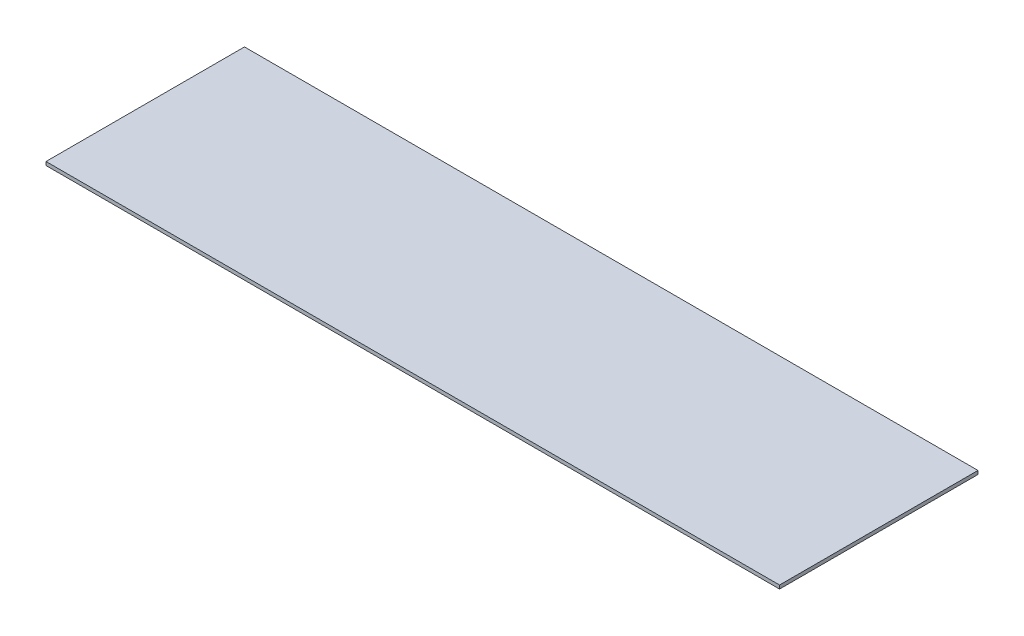
ISO-10303-21;
HEADER;
FILE_DESCRIPTION(('STEP AP214'),'2;1');
FILE_NAME('part.step','',(''),(''),'','','');
FILE_SCHEMA(('AUTOMOTIVE_DESIGN { 1 0 10303 214 1 1 1 1 }'));
ENDSEC;
DATA;
#1=APPLICATION_CONTEXT('core data for automotive mechanical design processes');
#2=APPLICATION_PROTOCOL_DEFINITION('international standard','automotive_design',2000,#1);
#3=PRODUCT_CONTEXT('',#1,'mechanical');
#4=PRODUCT('Part','Part','',(#3));
#5=PRODUCT_RELATED_PRODUCT_CATEGORY('part','',(#4));
#6=PRODUCT_DEFINITION_FORMATION('','',#4);
#7=PRODUCT_DEFINITION_CONTEXT('part definition',#1,'design');
#8=PRODUCT_DEFINITION('design','',#6,#7);
#9=PRODUCT_DEFINITION_SHAPE('','',#8);
#10=(LENGTH_UNIT() NAMED_UNIT(*) SI_UNIT(.MILLI.,.METRE.));
#11=(NAMED_UNIT(*) PLANE_ANGLE_UNIT() SI_UNIT($,.RADIAN.));
#12=(NAMED_UNIT(*) SI_UNIT($,.STERADIAN.) SOLID_ANGLE_UNIT());
#13=UNCERTAINTY_MEASURE_WITH_UNIT(LENGTH_MEASURE(1.E-05),#10,'distance_accuracy_value','');
#14=(GEOMETRIC_REPRESENTATION_CONTEXT(3) GLOBAL_UNCERTAINTY_ASSIGNED_CONTEXT((#13)) GLOBAL_UNIT_ASSIGNED_CONTEXT((#10,
#11,#12)) REPRESENTATION_CONTEXT('',''));
#15=CARTESIAN_POINT('',(0.,0.,0.));
#16=DIRECTION('',(0.,0.,1.));
#17=DIRECTION('',(1.,0.,0.));
#18=AXIS2_PLACEMENT_3D('',#15,#16,#17);
#19=CARTESIAN_POINT('',(328.61758,-3.175,-88.9));
#20=DIRECTION('',(1.,0.,0.));
#21=DIRECTION('',(0.,0.,-1.));
#22=AXIS2_PLACEMENT_3D('',#19,#20,#21);
#23=PLANE('',#22);
#24=DIRECTION('',(0.,0.,-1.));
#25=VECTOR('',#24,1.);
#26=CARTESIAN_POINT('',(328.61758,0.,-88.9));
#27=LINE('',#26,#25);
#28=CARTESIAN_POINT('',(328.61758,0.,88.9));
#29=VERTEX_POINT('',#28);
#30=CARTESIAN_POINT('',(328.61758,0.,-88.9));
#31=VERTEX_POINT('',#30);
#32=EDGE_CURVE('E102',#29,#31,#27,.T.);
#33=ORIENTED_EDGE('',*,*,#32,.F.);
#34=DIRECTION('',(0.,1.,0.));
#35=VECTOR('',#34,1.);
#36=CARTESIAN_POINT('',(328.61758,-3.175,88.9));
#37=LINE('',#36,#35);
#38=CARTESIAN_POINT('',(328.61758,-3.175,88.9));
#39=VERTEX_POINT('',#38);
#40=EDGE_CURVE('E11',#39,#29,#37,.T.);
#41=ORIENTED_EDGE('',*,*,#40,.F.);
#42=DIRECTION('',(0.,0.,-1.));
#43=VECTOR('',#42,1.);
#44=CARTESIAN_POINT('',(328.61758,-3.175,-88.9));
#45=LINE('',#44,#43);
#46=CARTESIAN_POINT('',(328.61758,-3.175,-88.9));
#47=VERTEX_POINT('',#46);
#48=EDGE_CURVE('E96',#39,#47,#45,.T.);
#49=ORIENTED_EDGE('',*,*,#48,.T.);
#50=DIRECTION('',(0.,1.,0.));
#51=VECTOR('',#50,1.);
#52=CARTESIAN_POINT('',(328.61758,-3.175,-88.9));
#53=LINE('',#52,#51);
#54=EDGE_CURVE('E41',#47,#31,#53,.T.);
#55=ORIENTED_EDGE('',*,*,#54,.T.);
#56=EDGE_LOOP('',(#33,#41,#49,#55));
#57=FACE_BOUND('',#56,.T.);
#58=ADVANCED_FACE('F38',(#57),#23,.T.);
#59=CARTESIAN_POINT('',(-328.61758,-3.175,88.9));
#60=DIRECTION('',(0.,0.,1.));
#61=DIRECTION('',(1.,0.,0.));
#62=AXIS2_PLACEMENT_3D('',#59,#60,#61);
#63=PLANE('',#62);
#64=DIRECTION('',(1.,0.,0.));
#65=VECTOR('',#64,1.);
#66=CARTESIAN_POINT('',(-328.61758,0.,88.9));
#67=LINE('',#66,#65);
#68=CARTESIAN_POINT('',(-328.61758,0.,88.9));
#69=VERTEX_POINT('',#68);
#70=EDGE_CURVE('E98',#69,#29,#67,.T.);
#71=ORIENTED_EDGE('',*,*,#70,.F.);
#72=DIRECTION('',(0.,1.,0.));
#73=VECTOR('',#72,1.);
#74=CARTESIAN_POINT('',(-328.61758,-3.175,88.9));
#75=LINE('',#74,#73);
#76=CARTESIAN_POINT('',(-328.61758,-3.175,88.9));
#77=VERTEX_POINT('',#76);
#78=EDGE_CURVE('E47',#77,#69,#75,.T.);
#79=ORIENTED_EDGE('',*,*,#78,.F.);
#80=DIRECTION('',(1.,0.,0.));
#81=VECTOR('',#80,1.);
#82=CARTESIAN_POINT('',(-328.61758,-3.175,88.9));
#83=LINE('',#82,#81);
#84=EDGE_CURVE('E93',#77,#39,#83,.T.);
#85=ORIENTED_EDGE('',*,*,#84,.T.);
#86=ORIENTED_EDGE('',*,*,#40,.T.);
#87=EDGE_LOOP('',(#71,#79,#85,#86));
#88=FACE_BOUND('',#87,.T.);
#89=ADVANCED_FACE('F112',(#88),#63,.T.);
#90=CARTESIAN_POINT('',(-328.61758,-3.175,-88.9));
#91=DIRECTION('',(-1.,0.,0.));
#92=DIRECTION('',(0.,0.,1.));
#93=AXIS2_PLACEMENT_3D('',#90,#91,#92);
#94=PLANE('',#93);
#95=DIRECTION('',(0.,0.,1.));
#96=VECTOR('',#95,1.);
#97=CARTESIAN_POINT('',(-328.61758,0.,-88.9));
#98=LINE('',#97,#96);
#99=CARTESIAN_POINT('',(-328.61758,0.,-88.9));
#100=VERTEX_POINT('',#99);
#101=EDGE_CURVE('E88',#100,#69,#98,.T.);
#102=ORIENTED_EDGE('',*,*,#101,.F.);
#103=DIRECTION('',(0.,1.,0.));
#104=VECTOR('',#103,1.);
#105=CARTESIAN_POINT('',(-328.61758,-3.175,-88.9));
#106=LINE('',#105,#104);
#107=CARTESIAN_POINT('',(-328.61758,-3.175,-88.9));
#108=VERTEX_POINT('',#107);
#109=EDGE_CURVE('E83',#108,#100,#106,.T.);
#110=ORIENTED_EDGE('',*,*,#109,.F.);
#111=DIRECTION('',(0.,0.,1.));
#112=VECTOR('',#111,1.);
#113=CARTESIAN_POINT('',(-328.61758,-3.175,-88.9));
#114=LINE('',#113,#112);
#115=EDGE_CURVE('E86',#108,#77,#114,.T.);
#116=ORIENTED_EDGE('',*,*,#115,.T.);
#117=ORIENTED_EDGE('',*,*,#78,.T.);
#118=EDGE_LOOP('',(#102,#110,#116,#117));
#119=FACE_BOUND('',#118,.T.);
#120=ADVANCED_FACE('F85',(#119),#94,.T.);
#121=CARTESIAN_POINT('',(-328.61758,-3.175,-88.9));
#122=DIRECTION('',(0.,0.,-1.));
#123=DIRECTION('',(-1.,0.,0.));
#124=AXIS2_PLACEMENT_3D('',#121,#122,#123);
#125=PLANE('',#124);
#126=DIRECTION('',(-1.,0.,0.));
#127=VECTOR('',#126,1.);
#128=CARTESIAN_POINT('',(-328.61758,0.,-88.9));
#129=LINE('',#128,#127);
#130=EDGE_CURVE('E105',#31,#100,#129,.T.);
#131=ORIENTED_EDGE('',*,*,#130,.F.);
#132=ORIENTED_EDGE('',*,*,#54,.F.);
#133=DIRECTION('',(-1.,0.,0.));
#134=VECTOR('',#133,1.);
#135=CARTESIAN_POINT('',(-328.61758,-3.175,-88.9));
#136=LINE('',#135,#134);
#137=EDGE_CURVE('E92',#47,#108,#136,.T.);
#138=ORIENTED_EDGE('',*,*,#137,.T.);
#139=ORIENTED_EDGE('',*,*,#109,.T.);
#140=EDGE_LOOP('',(#131,#132,#138,#139));
#141=FACE_BOUND('',#140,.T.);
#142=ADVANCED_FACE('F95',(#141),#125,.T.);
#143=CARTESIAN_POINT('',(0.,-3.175,0.));
#144=DIRECTION('',(0.,1.,0.));
#145=DIRECTION('',(0.,0.,1.));
#146=AXIS2_PLACEMENT_3D('',#143,#144,#145);
#147=PLANE('',#146);
#148=ORIENTED_EDGE('',*,*,#48,.F.);
#149=ORIENTED_EDGE('',*,*,#84,.F.);
#150=ORIENTED_EDGE('',*,*,#115,.F.);
#151=ORIENTED_EDGE('',*,*,#137,.F.);
#152=EDGE_LOOP('',(#148,#149,#150,#151));
#153=FACE_BOUND('',#152,.T.);
#154=ADVANCED_FACE('F91',(#153),#147,.F.);
#155=CARTESIAN_POINT('',(0.,0.,0.));
#156=DIRECTION('',(0.,1.,0.));
#157=DIRECTION('',(0.,0.,1.));
#158=AXIS2_PLACEMENT_3D('',#155,#156,#157);
#159=PLANE('',#158);
#160=ORIENTED_EDGE('',*,*,#32,.T.);
#161=ORIENTED_EDGE('',*,*,#130,.T.);
#162=ORIENTED_EDGE('',*,*,#101,.T.);
#163=ORIENTED_EDGE('',*,*,#70,.T.);
#164=EDGE_LOOP('',(#160,#161,#162,#163));
#165=FACE_BOUND('',#164,.T.);
#166=ADVANCED_FACE('F111',(#165),#159,.T.);
#167=CLOSED_SHELL('',(#58,#89,#120,#142,#154,#166));
#168=MANIFOLD_SOLID_BREP('B2',#167);
#169=ADVANCED_BREP_SHAPE_REPRESENTATION('',(#18,#168),#14);
#170=SHAPE_DEFINITION_REPRESENTATION(#9,#169);
ENDSEC;
END-ISO-10303-21;
